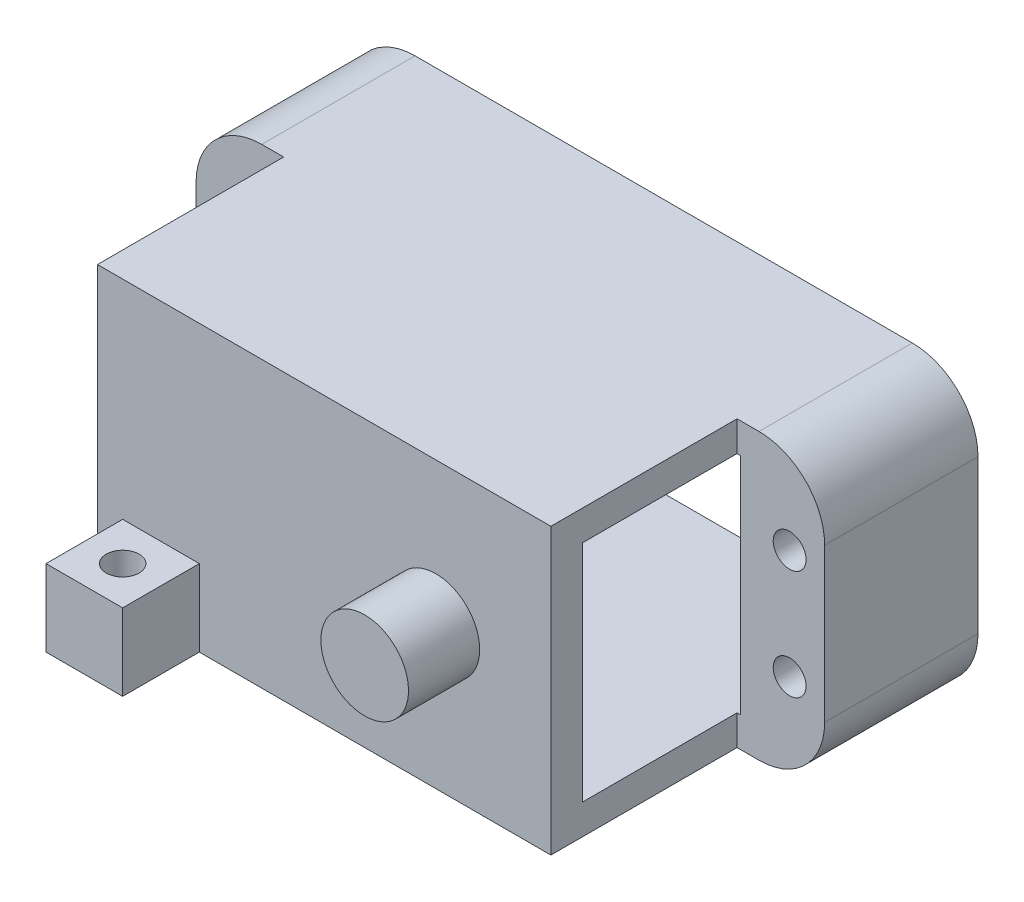
ISO-10303-21;
HEADER;
FILE_DESCRIPTION(('STEP AP214'),'2;1');
FILE_NAME('part.step','',(''),(''),'','','');
FILE_SCHEMA(('AUTOMOTIVE_DESIGN { 1 0 10303 214 1 1 1 1 }'));
ENDSEC;
DATA;
#1=APPLICATION_CONTEXT('core data for automotive mechanical design processes');
#2=APPLICATION_PROTOCOL_DEFINITION('international standard','automotive_design',2000,#1);
#3=PRODUCT_CONTEXT('',#1,'mechanical');
#4=PRODUCT('Part','Part','',(#3));
#5=PRODUCT_RELATED_PRODUCT_CATEGORY('part','',(#4));
#6=PRODUCT_DEFINITION_FORMATION('','',#4);
#7=PRODUCT_DEFINITION_CONTEXT('part definition',#1,'design');
#8=PRODUCT_DEFINITION('design','',#6,#7);
#9=PRODUCT_DEFINITION_SHAPE('','',#8);
#10=(LENGTH_UNIT() NAMED_UNIT(*) SI_UNIT(.MILLI.,.METRE.));
#11=(NAMED_UNIT(*) PLANE_ANGLE_UNIT() SI_UNIT($,.RADIAN.));
#12=(NAMED_UNIT(*) SI_UNIT($,.STERADIAN.) SOLID_ANGLE_UNIT());
#13=UNCERTAINTY_MEASURE_WITH_UNIT(LENGTH_MEASURE(1.E-05),#10,'distance_accuracy_value','');
#14=(GEOMETRIC_REPRESENTATION_CONTEXT(3) GLOBAL_UNCERTAINTY_ASSIGNED_CONTEXT((#13)) GLOBAL_UNIT_ASSIGNED_CONTEXT((#10,
#11,#12)) REPRESENTATION_CONTEXT('',''));
#15=CARTESIAN_POINT('',(0.,0.,0.));
#16=DIRECTION('',(0.,0.,1.));
#17=DIRECTION('',(1.,0.,0.));
#18=AXIS2_PLACEMENT_3D('',#15,#16,#17);
#19=CARTESIAN_POINT('',(0.,0.,31.));
#20=DIRECTION('',(0.,0.,-1.));
#21=DIRECTION('',(-1.,0.,0.));
#22=AXIS2_PLACEMENT_3D('',#19,#20,#21);
#23=PLANE('',#22);
#24=CARTESIAN_POINT('',(10.2,0.,31.));
#25=DIRECTION('',(0.,0.,-1.));
#26=DIRECTION('',(-1.,0.,0.));
#27=AXIS2_PLACEMENT_3D('',#24,#25,#26);
#28=CIRCLE('',#27,4.);
#29=CARTESIAN_POINT('',(6.2,0.,31.));
#30=VERTEX_POINT('',#29);
#31=EDGE_CURVE('E867',#30,#30,#28,.T.);
#32=ORIENTED_EDGE('',*,*,#31,.T.);
#33=EDGE_LOOP('',(#32));
#34=FACE_BOUND('',#33,.T.);
#35=DIRECTION('',(0.,1.,0.));
#36=VECTOR('',#35,1.);
#37=CARTESIAN_POINT('',(-11.4,-13.,31.));
#38=LINE('',#37,#36);
#39=CARTESIAN_POINT('',(-11.4,-13.,31.));
#40=VERTEX_POINT('',#39);
#41=CARTESIAN_POINT('',(-11.4,-6.,31.));
#42=VERTEX_POINT('',#41);
#43=EDGE_CURVE('E239',#40,#42,#38,.T.);
#44=ORIENTED_EDGE('',*,*,#43,.F.);
#45=DIRECTION('',(1.,0.,0.));
#46=VECTOR('',#45,1.);
#47=CARTESIAN_POINT('',(20.7,-13.,31.));
#48=LINE('',#47,#46);
#49=CARTESIAN_POINT('',(20.7,-13.,31.));
#50=VERTEX_POINT('',#49);
#51=EDGE_CURVE('E353',#40,#50,#48,.T.);
#52=ORIENTED_EDGE('',*,*,#51,.T.);
#53=DIRECTION('',(0.,1.,0.));
#54=VECTOR('',#53,1.);
#55=CARTESIAN_POINT('',(20.7,13.,31.));
#56=LINE('',#55,#54);
#57=CARTESIAN_POINT('',(20.7,13.,31.));
#58=VERTEX_POINT('',#57);
#59=EDGE_CURVE('E356',#50,#58,#56,.T.);
#60=ORIENTED_EDGE('',*,*,#59,.T.);
#61=DIRECTION('',(-1.,0.,0.));
#62=VECTOR('',#61,1.);
#63=CARTESIAN_POINT('',(-20.7,13.,31.));
#64=LINE('',#63,#62);
#65=CARTESIAN_POINT('',(-20.7,13.,31.));
#66=VERTEX_POINT('',#65);
#67=EDGE_CURVE('E347',#58,#66,#64,.T.);
#68=ORIENTED_EDGE('',*,*,#67,.T.);
#69=DIRECTION('',(0.,-1.,0.));
#70=VECTOR('',#69,1.);
#71=CARTESIAN_POINT('',(-20.7,-13.,31.));
#72=LINE('',#71,#70);
#73=CARTESIAN_POINT('',(-20.7,-13.,31.));
#74=VERTEX_POINT('',#73);
#75=EDGE_CURVE('E350',#66,#74,#72,.T.);
#76=ORIENTED_EDGE('',*,*,#75,.T.);
#77=CARTESIAN_POINT('',(-18.4,-13.,31.));
#78=VERTEX_POINT('',#77);
#79=EDGE_CURVE('E354',#74,#78,#48,.T.);
#80=ORIENTED_EDGE('',*,*,#79,.T.);
#81=DIRECTION('',(0.,-1.,0.));
#82=VECTOR('',#81,1.);
#83=CARTESIAN_POINT('',(-18.4,-5.99999999999999,31.));
#84=LINE('',#83,#82);
#85=CARTESIAN_POINT('',(-18.4,-5.99999999999999,31.));
#86=VERTEX_POINT('',#85);
#87=EDGE_CURVE('E859',#86,#78,#84,.T.);
#88=ORIENTED_EDGE('',*,*,#87,.F.);
#89=DIRECTION('',(-1.,0.,0.));
#90=VECTOR('',#89,1.);
#91=CARTESIAN_POINT('',(-11.4,-6.,31.));
#92=LINE('',#91,#90);
#93=EDGE_CURVE('E242',#42,#86,#92,.T.);
#94=ORIENTED_EDGE('',*,*,#93,.F.);
#95=EDGE_LOOP('',(#44,#52,#60,#68,#76,#80,#88,#94));
#96=FACE_BOUND('',#95,.T.);
#97=ADVANCED_FACE('F33',(#34,#96),#23,.F.);
#98=CARTESIAN_POINT('',(0.,0.,14.));
#99=DIRECTION('',(0.,0.,-1.));
#100=DIRECTION('',(-1.,0.,0.));
#101=AXIS2_PLACEMENT_3D('',#98,#99,#100);
#102=PLANE('',#101);
#103=CARTESIAN_POINT('',(25.5,-5.,14.));
#104=DIRECTION('',(0.,0.,-1.));
#105=DIRECTION('',(-1.,0.,0.));
#106=AXIS2_PLACEMENT_3D('',#103,#104,#105);
#107=CIRCLE('',#106,1.49999999999999);
#108=CARTESIAN_POINT('',(24.,-5.,14.));
#109=VERTEX_POINT('',#108);
#110=EDGE_CURVE('E887',#109,#109,#107,.T.);
#111=ORIENTED_EDGE('',*,*,#110,.T.);
#112=EDGE_LOOP('',(#111));
#113=FACE_BOUND('',#112,.T.);
#114=CARTESIAN_POINT('',(25.5,5.,14.));
#115=DIRECTION('',(0.,0.,-1.));
#116=DIRECTION('',(-1.,0.,0.));
#117=AXIS2_PLACEMENT_3D('',#114,#115,#116);
#118=CIRCLE('',#117,1.49999999999999);
#119=CARTESIAN_POINT('',(24.,5.,14.));
#120=VERTEX_POINT('',#119);
#121=EDGE_CURVE('E881',#120,#120,#118,.T.);
#122=ORIENTED_EDGE('',*,*,#121,.T.);
#123=EDGE_LOOP('',(#122));
#124=FACE_BOUND('',#123,.T.);
#125=DIRECTION('',(0.,-1.,0.));
#126=VECTOR('',#125,1.);
#127=CARTESIAN_POINT('',(28.7,-13.,14.));
#128=LINE('',#127,#126);
#129=CARTESIAN_POINT('',(28.7,6.99999999999999,14.));
#130=VERTEX_POINT('',#129);
#131=CARTESIAN_POINT('',(28.7,-7.,14.));
#132=VERTEX_POINT('',#131);
#133=EDGE_CURVE('E282',#130,#132,#128,.T.);
#134=ORIENTED_EDGE('',*,*,#133,.F.);
#135=CARTESIAN_POINT('',(22.7,7.,14.));
#136=DIRECTION('',(0.,0.,-1.));
#137=DIRECTION('',(-1.,0.,0.));
#138=AXIS2_PLACEMENT_3D('',#135,#136,#137);
#139=CIRCLE('',#138,6.);
#140=CARTESIAN_POINT('',(22.7,13.,14.));
#141=VERTEX_POINT('',#140);
#142=EDGE_CURVE('E410',#130,#141,#139,.F.);
#143=ORIENTED_EDGE('',*,*,#142,.T.);
#144=DIRECTION('',(1.,0.,0.));
#145=VECTOR('',#144,1.);
#146=CARTESIAN_POINT('',(-28.7,13.,14.));
#147=LINE('',#146,#145);
#148=CARTESIAN_POINT('',(20.7,13.,14.));
#149=VERTEX_POINT('',#148);
#150=EDGE_CURVE('E380',#149,#141,#147,.T.);
#151=ORIENTED_EDGE('',*,*,#150,.F.);
#152=DIRECTION('',(0.,1.,0.));
#153=VECTOR('',#152,1.);
#154=CARTESIAN_POINT('',(20.7,13.,14.));
#155=LINE('',#154,#153);
#156=CARTESIAN_POINT('',(20.7,10.25,14.));
#157=VERTEX_POINT('',#156);
#158=EDGE_CURVE('E362',#157,#149,#155,.T.);
#159=ORIENTED_EDGE('',*,*,#158,.F.);
#160=DIRECTION('',(1.,0.,0.));
#161=VECTOR('',#160,1.);
#162=CARTESIAN_POINT('',(20.7,10.25,14.));
#163=LINE('',#162,#161);
#164=CARTESIAN_POINT('',(21.,10.25,14.));
#165=VERTEX_POINT('',#164);
#166=EDGE_CURVE('E316',#157,#165,#163,.T.);
#167=ORIENTED_EDGE('',*,*,#166,.T.);
#168=DIRECTION('',(0.,-1.,0.));
#169=VECTOR('',#168,1.);
#170=CARTESIAN_POINT('',(21.,-13.,14.));
#171=LINE('',#170,#169);
#172=CARTESIAN_POINT('',(21.,-10.25,14.));
#173=VERTEX_POINT('',#172);
#174=EDGE_CURVE('E283',#165,#173,#171,.T.);
#175=ORIENTED_EDGE('',*,*,#174,.T.);
#176=DIRECTION('',(1.,0.,0.));
#177=VECTOR('',#176,1.);
#178=CARTESIAN_POINT('',(20.7,-10.25,14.));
#179=LINE('',#178,#177);
#180=CARTESIAN_POINT('',(20.7,-10.25,14.));
#181=VERTEX_POINT('',#180);
#182=EDGE_CURVE('E293',#181,#173,#179,.T.);
#183=ORIENTED_EDGE('',*,*,#182,.F.);
#184=CARTESIAN_POINT('',(20.7,-13.,14.));
#185=VERTEX_POINT('',#184);
#186=EDGE_CURVE('E351',#185,#181,#155,.T.);
#187=ORIENTED_EDGE('',*,*,#186,.F.);
#188=DIRECTION('',(-1.,0.,0.));
#189=VECTOR('',#188,1.);
#190=CARTESIAN_POINT('',(21.,-13.,14.));
#191=LINE('',#190,#189);
#192=CARTESIAN_POINT('',(22.7,-13.,14.));
#193=VERTEX_POINT('',#192);
#194=EDGE_CURVE('E381',#193,#185,#191,.T.);
#195=ORIENTED_EDGE('',*,*,#194,.F.);
#196=CARTESIAN_POINT('',(22.7,-7.,14.));
#197=DIRECTION('',(0.,0.,-1.));
#198=DIRECTION('',(-1.,0.,0.));
#199=AXIS2_PLACEMENT_3D('',#196,#197,#198);
#200=CIRCLE('',#199,6.);
#201=EDGE_CURVE('E408',#193,#132,#200,.F.);
#202=ORIENTED_EDGE('',*,*,#201,.T.);
#203=EDGE_LOOP('',(#134,#143,#151,#159,#167,#175,#183,#187,#195,#202));
#204=FACE_BOUND('',#203,.T.);
#205=ADVANCED_FACE('F500',(#113,#124,#204),#102,.F.);
#206=CARTESIAN_POINT('',(-25.5,-5.,14.));
#207=DIRECTION('',(0.,0.,-1.));
#208=DIRECTION('',(-1.,0.,0.));
#209=AXIS2_PLACEMENT_3D('',#206,#207,#208);
#210=CIRCLE('',#209,1.49999999999999);
#211=CARTESIAN_POINT('',(-27.,-5.,14.));
#212=VERTEX_POINT('',#211);
#213=EDGE_CURVE('E875',#212,#212,#210,.T.);
#214=ORIENTED_EDGE('',*,*,#213,.T.);
#215=EDGE_LOOP('',(#214));
#216=FACE_BOUND('',#215,.T.);
#217=CARTESIAN_POINT('',(-25.5,5.,14.));
#218=DIRECTION('',(0.,0.,-1.));
#219=DIRECTION('',(-1.,0.,0.));
#220=AXIS2_PLACEMENT_3D('',#217,#218,#219);
#221=CIRCLE('',#220,1.49999999999999);
#222=CARTESIAN_POINT('',(-27.,5.,14.));
#223=VERTEX_POINT('',#222);
#224=EDGE_CURVE('E869',#223,#223,#221,.T.);
#225=ORIENTED_EDGE('',*,*,#224,.T.);
#226=EDGE_LOOP('',(#225));
#227=FACE_BOUND('',#226,.T.);
#228=CARTESIAN_POINT('',(-22.7,13.,14.));
#229=VERTEX_POINT('',#228);
#230=CARTESIAN_POINT('',(-20.7,13.,14.));
#231=VERTEX_POINT('',#230);
#232=EDGE_CURVE('E377',#229,#231,#147,.T.);
#233=ORIENTED_EDGE('',*,*,#232,.F.);
#234=CARTESIAN_POINT('',(-22.7,7.,14.));
#235=DIRECTION('',(0.,0.,-1.));
#236=DIRECTION('',(-1.,0.,0.));
#237=AXIS2_PLACEMENT_3D('',#234,#235,#236);
#238=CIRCLE('',#237,6.);
#239=CARTESIAN_POINT('',(-28.7,6.99999999999999,14.));
#240=VERTEX_POINT('',#239);
#241=EDGE_CURVE('E11',#229,#240,#238,.F.);
#242=ORIENTED_EDGE('',*,*,#241,.T.);
#243=DIRECTION('',(0.,1.,0.));
#244=VECTOR('',#243,1.);
#245=CARTESIAN_POINT('',(-28.7,-13.,14.));
#246=LINE('',#245,#244);
#247=CARTESIAN_POINT('',(-28.7,-7.,14.));
#248=VERTEX_POINT('',#247);
#249=EDGE_CURVE('E383',#248,#240,#246,.T.);
#250=ORIENTED_EDGE('',*,*,#249,.F.);
#251=CARTESIAN_POINT('',(-22.7,-7.,14.));
#252=DIRECTION('',(0.,0.,-1.));
#253=DIRECTION('',(-1.,0.,0.));
#254=AXIS2_PLACEMENT_3D('',#251,#252,#253);
#255=CIRCLE('',#254,6.);
#256=CARTESIAN_POINT('',(-22.7,-13.,14.));
#257=VERTEX_POINT('',#256);
#258=EDGE_CURVE('E41',#248,#257,#255,.F.);
#259=ORIENTED_EDGE('',*,*,#258,.T.);
#260=CARTESIAN_POINT('',(-20.7,-13.,14.));
#261=VERTEX_POINT('',#260);
#262=EDGE_CURVE('E379',#261,#257,#191,.T.);
#263=ORIENTED_EDGE('',*,*,#262,.F.);
#264=DIRECTION('',(0.,-1.,0.));
#265=VECTOR('',#264,1.);
#266=CARTESIAN_POINT('',(-20.7,-13.,14.));
#267=LINE('',#266,#265);
#268=CARTESIAN_POINT('',(-20.7,-10.25,14.));
#269=VERTEX_POINT('',#268);
#270=EDGE_CURVE('E339',#269,#261,#267,.T.);
#271=ORIENTED_EDGE('',*,*,#270,.F.);
#272=DIRECTION('',(1.,0.,0.));
#273=VECTOR('',#272,1.);
#274=CARTESIAN_POINT('',(-21.,-10.25,14.));
#275=LINE('',#274,#273);
#276=CARTESIAN_POINT('',(-21.,-10.25,14.));
#277=VERTEX_POINT('',#276);
#278=EDGE_CURVE('E306',#277,#269,#275,.T.);
#279=ORIENTED_EDGE('',*,*,#278,.F.);
#280=DIRECTION('',(0.,1.,0.));
#281=VECTOR('',#280,1.);
#282=CARTESIAN_POINT('',(-21.,-10.25,14.));
#283=LINE('',#282,#281);
#284=CARTESIAN_POINT('',(-21.,10.25,14.));
#285=VERTEX_POINT('',#284);
#286=EDGE_CURVE('E343',#277,#285,#283,.T.);
#287=ORIENTED_EDGE('',*,*,#286,.T.);
#288=DIRECTION('',(1.,0.,0.));
#289=VECTOR('',#288,1.);
#290=CARTESIAN_POINT('',(-21.,10.25,14.));
#291=LINE('',#290,#289);
#292=CARTESIAN_POINT('',(-20.7,10.25,14.));
#293=VERTEX_POINT('',#292);
#294=EDGE_CURVE('E328',#285,#293,#291,.T.);
#295=ORIENTED_EDGE('',*,*,#294,.T.);
#296=EDGE_CURVE('E359',#231,#293,#267,.T.);
#297=ORIENTED_EDGE('',*,*,#296,.F.);
#298=EDGE_LOOP('',(#233,#242,#250,#259,#263,#271,#279,#287,#295,#297));
#299=FACE_BOUND('',#298,.T.);
#300=ADVANCED_FACE('F435',(#216,#227,#299),#102,.F.);
#301=CARTESIAN_POINT('',(-28.7,13.,14.));
#302=DIRECTION('',(0.,1.,0.));
#303=DIRECTION('',(0.,0.,1.));
#304=AXIS2_PLACEMENT_3D('',#301,#302,#303);
#305=PLANE('',#304);
#306=ORIENTED_EDGE('',*,*,#150,.T.);
#307=DIRECTION('',(0.,0.,1.));
#308=VECTOR('',#307,1.);
#309=CARTESIAN_POINT('',(22.7,13.,0.));
#310=LINE('',#309,#308);
#311=CARTESIAN_POINT('',(22.7,13.,0.));
#312=VERTEX_POINT('',#311);
#313=EDGE_CURVE('E414',#141,#312,#310,.F.);
#314=ORIENTED_EDGE('',*,*,#313,.T.);
#315=DIRECTION('',(1.,0.,0.));
#316=VECTOR('',#315,1.);
#317=CARTESIAN_POINT('',(-28.7,13.,0.));
#318=LINE('',#317,#316);
#319=CARTESIAN_POINT('',(-22.7,13.,0.));
#320=VERTEX_POINT('',#319);
#321=EDGE_CURVE('E376',#320,#312,#318,.T.);
#322=ORIENTED_EDGE('',*,*,#321,.F.);
#323=DIRECTION('',(0.,0.,-1.));
#324=VECTOR('',#323,1.);
#325=CARTESIAN_POINT('',(-22.7,13.,14.));
#326=LINE('',#325,#324);
#327=EDGE_CURVE('E412',#320,#229,#326,.F.);
#328=ORIENTED_EDGE('',*,*,#327,.T.);
#329=ORIENTED_EDGE('',*,*,#232,.T.);
#330=DIRECTION('',(0.,0.,-1.));
#331=VECTOR('',#330,1.);
#332=CARTESIAN_POINT('',(-20.7,13.,31.));
#333=LINE('',#332,#331);
#334=EDGE_CURVE('E373',#66,#231,#333,.T.);
#335=ORIENTED_EDGE('',*,*,#334,.F.);
#336=ORIENTED_EDGE('',*,*,#67,.F.);
#337=DIRECTION('',(0.,0.,-1.));
#338=VECTOR('',#337,1.);
#339=CARTESIAN_POINT('',(20.7,13.,31.));
#340=LINE('',#339,#338);
#341=EDGE_CURVE('E358',#58,#149,#340,.T.);
#342=ORIENTED_EDGE('',*,*,#341,.T.);
#343=EDGE_LOOP('',(#306,#314,#322,#328,#329,#335,#336,#342));
#344=FACE_BOUND('',#343,.T.);
#345=ADVANCED_FACE('F457',(#344),#305,.T.);
#346=CARTESIAN_POINT('',(-28.7,-13.,14.));
#347=DIRECTION('',(-1.,0.,0.));
#348=DIRECTION('',(0.,0.,1.));
#349=AXIS2_PLACEMENT_3D('',#346,#347,#348);
#350=PLANE('',#349);
#351=ORIENTED_EDGE('',*,*,#249,.T.);
#352=DIRECTION('',(0.,0.,-1.));
#353=VECTOR('',#352,1.);
#354=CARTESIAN_POINT('',(-28.7,7.,14.));
#355=LINE('',#354,#353);
#356=CARTESIAN_POINT('',(-28.7,6.99999999999999,0.));
#357=VERTEX_POINT('',#356);
#358=EDGE_CURVE('E430',#240,#357,#355,.T.);
#359=ORIENTED_EDGE('',*,*,#358,.T.);
#360=DIRECTION('',(0.,1.,0.));
#361=VECTOR('',#360,1.);
#362=CARTESIAN_POINT('',(-28.7,-13.,0.));
#363=LINE('',#362,#361);
#364=CARTESIAN_POINT('',(-28.7,-7.,0.));
#365=VERTEX_POINT('',#364);
#366=EDGE_CURVE('E391',#365,#357,#363,.T.);
#367=ORIENTED_EDGE('',*,*,#366,.F.);
#368=DIRECTION('',(0.,0.,-1.));
#369=VECTOR('',#368,1.);
#370=CARTESIAN_POINT('',(-28.7,-7.,14.));
#371=LINE('',#370,#369);
#372=EDGE_CURVE('E53',#365,#248,#371,.F.);
#373=ORIENTED_EDGE('',*,*,#372,.T.);
#374=EDGE_LOOP('',(#351,#359,#367,#373));
#375=FACE_BOUND('',#374,.T.);
#376=ADVANCED_FACE('F448',(#375),#350,.T.);
#377=CARTESIAN_POINT('',(21.,-13.,14.));
#378=DIRECTION('',(0.,-1.,0.));
#379=DIRECTION('',(0.,0.,-1.));
#380=AXIS2_PLACEMENT_3D('',#377,#378,#379);
#381=PLANE('',#380);
#382=CARTESIAN_POINT('',(-14.9,-13.,34.5));
#383=DIRECTION('',(0.,-1.,0.));
#384=DIRECTION('',(0.,0.,-1.));
#385=AXIS2_PLACEMENT_3D('',#382,#383,#384);
#386=CIRCLE('',#385,1.49999999999999);
#387=CARTESIAN_POINT('',(-14.9,-13.,33.));
#388=VERTEX_POINT('',#387);
#389=EDGE_CURVE('E402',#388,#388,#386,.T.);
#390=ORIENTED_EDGE('',*,*,#389,.F.);
#391=EDGE_LOOP('',(#390));
#392=FACE_BOUND('',#391,.T.);
#393=DIRECTION('',(-1.,0.,0.));
#394=VECTOR('',#393,1.);
#395=CARTESIAN_POINT('',(21.,-13.,0.));
#396=LINE('',#395,#394);
#397=CARTESIAN_POINT('',(22.7,-13.,0.));
#398=VERTEX_POINT('',#397);
#399=CARTESIAN_POINT('',(-2.4,-13.,0.));
#400=VERTEX_POINT('',#399);
#401=EDGE_CURVE('E389',#398,#400,#396,.T.);
#402=ORIENTED_EDGE('',*,*,#401,.F.);
#403=DIRECTION('',(0.,0.,-1.));
#404=VECTOR('',#403,1.);
#405=CARTESIAN_POINT('',(22.7,-13.,14.));
#406=LINE('',#405,#404);
#407=EDGE_CURVE('E427',#398,#193,#406,.F.);
#408=ORIENTED_EDGE('',*,*,#407,.T.);
#409=ORIENTED_EDGE('',*,*,#194,.T.);
#410=DIRECTION('',(0.,0.,-1.));
#411=VECTOR('',#410,1.);
#412=CARTESIAN_POINT('',(20.7,-13.,31.));
#413=LINE('',#412,#411);
#414=EDGE_CURVE('E367',#50,#185,#413,.T.);
#415=ORIENTED_EDGE('',*,*,#414,.F.);
#416=ORIENTED_EDGE('',*,*,#51,.F.);
#417=DIRECTION('',(0.,0.,-1.));
#418=VECTOR('',#417,1.);
#419=CARTESIAN_POINT('',(-11.4,-13.,38.));
#420=LINE('',#419,#418);
#421=CARTESIAN_POINT('',(-11.4,-13.,38.));
#422=VERTEX_POINT('',#421);
#423=EDGE_CURVE('E248',#422,#40,#420,.T.);
#424=ORIENTED_EDGE('',*,*,#423,.F.);
#425=DIRECTION('',(1.,0.,0.));
#426=VECTOR('',#425,1.);
#427=CARTESIAN_POINT('',(-18.4,-13.,38.));
#428=LINE('',#427,#426);
#429=CARTESIAN_POINT('',(-18.4,-13.,38.));
#430=VERTEX_POINT('',#429);
#431=EDGE_CURVE('E229',#430,#422,#428,.T.);
#432=ORIENTED_EDGE('',*,*,#431,.F.);
#433=DIRECTION('',(0.,0.,-1.));
#434=VECTOR('',#433,1.);
#435=CARTESIAN_POINT('',(-18.4,-13.,38.));
#436=LINE('',#435,#434);
#437=EDGE_CURVE('E226',#430,#78,#436,.T.);
#438=ORIENTED_EDGE('',*,*,#437,.T.);
#439=ORIENTED_EDGE('',*,*,#79,.F.);
#440=DIRECTION('',(0.,0.,-1.));
#441=VECTOR('',#440,1.);
#442=CARTESIAN_POINT('',(-20.7,-13.,31.));
#443=LINE('',#442,#441);
#444=EDGE_CURVE('E370',#74,#261,#443,.T.);
#445=ORIENTED_EDGE('',*,*,#444,.T.);
#446=ORIENTED_EDGE('',*,*,#262,.T.);
#447=DIRECTION('',(0.,0.,-1.));
#448=VECTOR('',#447,1.);
#449=CARTESIAN_POINT('',(-22.7,-13.,14.));
#450=LINE('',#449,#448);
#451=CARTESIAN_POINT('',(-22.7,-13.,0.));
#452=VERTEX_POINT('',#451);
#453=EDGE_CURVE('E424',#257,#452,#450,.T.);
#454=ORIENTED_EDGE('',*,*,#453,.T.);
#455=CARTESIAN_POINT('',(-10.4,-13.,0.));
#456=VERTEX_POINT('',#455);
#457=EDGE_CURVE('E388',#456,#452,#396,.T.);
#458=ORIENTED_EDGE('',*,*,#457,.F.);
#459=DIRECTION('',(0.,0.,-1.));
#460=VECTOR('',#459,1.);
#461=CARTESIAN_POINT('',(-10.4,-13.,14.));
#462=LINE('',#461,#460);
#463=CARTESIAN_POINT('',(-10.4,-13.,5.));
#464=VERTEX_POINT('',#463);
#465=EDGE_CURVE('E246',#464,#456,#462,.T.);
#466=ORIENTED_EDGE('',*,*,#465,.F.);
#467=DIRECTION('',(-1.,0.,0.));
#468=VECTOR('',#467,1.);
#469=CARTESIAN_POINT('',(21.,-13.,5.));
#470=LINE('',#469,#468);
#471=CARTESIAN_POINT('',(-2.4,-13.,5.));
#472=VERTEX_POINT('',#471);
#473=EDGE_CURVE('E243',#472,#464,#470,.T.);
#474=ORIENTED_EDGE('',*,*,#473,.F.);
#475=DIRECTION('',(0.,0.,1.));
#476=VECTOR('',#475,1.);
#477=CARTESIAN_POINT('',(-2.4,-13.,14.));
#478=LINE('',#477,#476);
#479=EDGE_CURVE('E256',#400,#472,#478,.T.);
#480=ORIENTED_EDGE('',*,*,#479,.F.);
#481=EDGE_LOOP('',(#402,#408,#409,#415,#416,#424,#432,#438,#439,#445,#446,#454,#458,#466,#474,#480));
#482=FACE_BOUND('',#481,.T.);
#483=ADVANCED_FACE('F441',(#392,#482),#381,.T.);
#484=CARTESIAN_POINT('',(0.,0.,0.));
#485=DIRECTION('',(0.,0.,-1.));
#486=DIRECTION('',(-1.,0.,0.));
#487=AXIS2_PLACEMENT_3D('',#484,#485,#486);
#488=PLANE('',#487);
#489=CARTESIAN_POINT('',(25.5,-5.,0.));
#490=DIRECTION('',(0.,0.,-1.));
#491=DIRECTION('',(-1.,0.,0.));
#492=AXIS2_PLACEMENT_3D('',#489,#490,#491);
#493=CIRCLE('',#492,1.49999999999999);
#494=CARTESIAN_POINT('',(24.,-5.,0.));
#495=VERTEX_POINT('',#494);
#496=EDGE_CURVE('E397',#495,#495,#493,.T.);
#497=ORIENTED_EDGE('',*,*,#496,.F.);
#498=EDGE_LOOP('',(#497));
#499=FACE_BOUND('',#498,.T.);
#500=CARTESIAN_POINT('',(25.5,5.,0.));
#501=DIRECTION('',(0.,0.,-1.));
#502=DIRECTION('',(-1.,0.,0.));
#503=AXIS2_PLACEMENT_3D('',#500,#501,#502);
#504=CIRCLE('',#503,1.49999999999999);
#505=CARTESIAN_POINT('',(24.,5.,0.));
#506=VERTEX_POINT('',#505);
#507=EDGE_CURVE('E884',#506,#506,#504,.T.);
#508=ORIENTED_EDGE('',*,*,#507,.F.);
#509=EDGE_LOOP('',(#508));
#510=FACE_BOUND('',#509,.T.);
#511=CARTESIAN_POINT('',(-25.5,-5.,0.));
#512=DIRECTION('',(0.,0.,-1.));
#513=DIRECTION('',(-1.,0.,0.));
#514=AXIS2_PLACEMENT_3D('',#511,#512,#513);
#515=CIRCLE('',#514,1.49999999999999);
#516=CARTESIAN_POINT('',(-27.,-5.,0.));
#517=VERTEX_POINT('',#516);
#518=EDGE_CURVE('E878',#517,#517,#515,.T.);
#519=ORIENTED_EDGE('',*,*,#518,.F.);
#520=EDGE_LOOP('',(#519));
#521=FACE_BOUND('',#520,.T.);
#522=CARTESIAN_POINT('',(-25.5,5.,0.));
#523=DIRECTION('',(0.,0.,-1.));
#524=DIRECTION('',(-1.,0.,0.));
#525=AXIS2_PLACEMENT_3D('',#522,#523,#524);
#526=CIRCLE('',#525,1.49999999999999);
#527=CARTESIAN_POINT('',(-27.,5.,0.));
#528=VERTEX_POINT('',#527);
#529=EDGE_CURVE('E872',#528,#528,#526,.T.);
#530=ORIENTED_EDGE('',*,*,#529,.F.);
#531=EDGE_LOOP('',(#530));
#532=FACE_BOUND('',#531,.T.);
#533=ORIENTED_EDGE('',*,*,#321,.T.);
#534=CARTESIAN_POINT('',(22.7,7.,0.));
#535=DIRECTION('',(0.,0.,-1.));
#536=DIRECTION('',(-1.,0.,0.));
#537=AXIS2_PLACEMENT_3D('',#534,#535,#536);
#538=CIRCLE('',#537,6.);
#539=CARTESIAN_POINT('',(28.7,7.,0.));
#540=VERTEX_POINT('',#539);
#541=EDGE_CURVE('E422',#312,#540,#538,.T.);
#542=ORIENTED_EDGE('',*,*,#541,.T.);
#543=DIRECTION('',(0.,1.,0.));
#544=VECTOR('',#543,1.);
#545=CARTESIAN_POINT('',(28.7,13.,0.));
#546=LINE('',#545,#544);
#547=CARTESIAN_POINT('',(28.7,-6.99999999999999,0.));
#548=VERTEX_POINT('',#547);
#549=EDGE_CURVE('E279',#548,#540,#546,.T.);
#550=ORIENTED_EDGE('',*,*,#549,.F.);
#551=CARTESIAN_POINT('',(22.7,-7.,0.));
#552=DIRECTION('',(0.,0.,-1.));
#553=DIRECTION('',(-1.,0.,0.));
#554=AXIS2_PLACEMENT_3D('',#551,#552,#553);
#555=CIRCLE('',#554,6.);
#556=EDGE_CURVE('E420',#548,#398,#555,.T.);
#557=ORIENTED_EDGE('',*,*,#556,.T.);
#558=ORIENTED_EDGE('',*,*,#401,.T.);
#559=DIRECTION('',(0.,1.,0.));
#560=VECTOR('',#559,1.);
#561=CARTESIAN_POINT('',(-2.4,-20.,0.));
#562=LINE('',#561,#560);
#563=CARTESIAN_POINT('',(-2.4,-20.,0.));
#564=VERTEX_POINT('',#563);
#565=EDGE_CURVE('E269',#564,#400,#562,.T.);
#566=ORIENTED_EDGE('',*,*,#565,.F.);
#567=DIRECTION('',(1.,0.,0.));
#568=VECTOR('',#567,1.);
#569=CARTESIAN_POINT('',(21.,-20.,0.));
#570=LINE('',#569,#568);
#571=CARTESIAN_POINT('',(-10.4,-20.,0.));
#572=VERTEX_POINT('',#571);
#573=EDGE_CURVE('E258',#572,#564,#570,.T.);
#574=ORIENTED_EDGE('',*,*,#573,.F.);
#575=DIRECTION('',(0.,1.,0.));
#576=VECTOR('',#575,1.);
#577=CARTESIAN_POINT('',(-10.4,-20.,0.));
#578=LINE('',#577,#576);
#579=EDGE_CURVE('E272',#572,#456,#578,.T.);
#580=ORIENTED_EDGE('',*,*,#579,.T.);
#581=ORIENTED_EDGE('',*,*,#457,.T.);
#582=CARTESIAN_POINT('',(-22.7,-7.,0.));
#583=DIRECTION('',(0.,0.,-1.));
#584=DIRECTION('',(-1.,0.,0.));
#585=AXIS2_PLACEMENT_3D('',#582,#583,#584);
#586=CIRCLE('',#585,6.);
#587=EDGE_CURVE('E416',#452,#365,#586,.T.);
#588=ORIENTED_EDGE('',*,*,#587,.T.);
#589=ORIENTED_EDGE('',*,*,#366,.T.);
#590=CARTESIAN_POINT('',(-22.7,7.,0.));
#591=DIRECTION('',(0.,0.,-1.));
#592=DIRECTION('',(-1.,0.,0.));
#593=AXIS2_PLACEMENT_3D('',#590,#591,#592);
#594=CIRCLE('',#593,6.);
#595=EDGE_CURVE('E418',#357,#320,#594,.T.);
#596=ORIENTED_EDGE('',*,*,#595,.T.);
#597=EDGE_LOOP('',(#533,#542,#550,#557,#558,#566,#574,#580,#581,#588,#589,#596));
#598=FACE_BOUND('',#597,.T.);
#599=DIRECTION('',(-1.,0.,0.));
#600=VECTOR('',#599,1.);
#601=CARTESIAN_POINT('',(21.,-10.25,0.));
#602=LINE('',#601,#600);
#603=CARTESIAN_POINT('',(21.,-10.25,0.));
#604=VERTEX_POINT('',#603);
#605=CARTESIAN_POINT('',(-21.,-10.25,0.));
#606=VERTEX_POINT('',#605);
#607=EDGE_CURVE('E300',#604,#606,#602,.T.);
#608=ORIENTED_EDGE('',*,*,#607,.F.);
#609=DIRECTION('',(0.,1.,0.));
#610=VECTOR('',#609,1.);
#611=CARTESIAN_POINT('',(21.,13.,0.));
#612=LINE('',#611,#610);
#613=CARTESIAN_POINT('',(21.,10.25,0.));
#614=VERTEX_POINT('',#613);
#615=EDGE_CURVE('E278',#604,#614,#612,.T.);
#616=ORIENTED_EDGE('',*,*,#615,.T.);
#617=DIRECTION('',(-1.,0.,0.));
#618=VECTOR('',#617,1.);
#619=CARTESIAN_POINT('',(21.,10.25,0.));
#620=LINE('',#619,#618);
#621=CARTESIAN_POINT('',(-21.,10.25,0.));
#622=VERTEX_POINT('',#621);
#623=EDGE_CURVE('E322',#614,#622,#620,.T.);
#624=ORIENTED_EDGE('',*,*,#623,.T.);
#625=DIRECTION('',(0.,1.,0.));
#626=VECTOR('',#625,1.);
#627=CARTESIAN_POINT('',(-21.,-10.25,0.));
#628=LINE('',#627,#626);
#629=EDGE_CURVE('E313',#606,#622,#628,.T.);
#630=ORIENTED_EDGE('',*,*,#629,.F.);
#631=EDGE_LOOP('',(#608,#616,#624,#630));
#632=FACE_BOUND('',#631,.T.);
#633=ADVANCED_FACE('F446',(#499,#510,#521,#532,#598,#632),#488,.T.);
#634=CARTESIAN_POINT('',(-20.7,-13.,31.));
#635=DIRECTION('',(1.,0.,0.));
#636=DIRECTION('',(0.,0.,-1.));
#637=AXIS2_PLACEMENT_3D('',#634,#635,#636);
#638=PLANE('',#637);
#639=DIRECTION('',(0.,1.,0.));
#640=VECTOR('',#639,1.);
#641=CARTESIAN_POINT('',(-20.7,-10.25,28.1));
#642=LINE('',#641,#640);
#643=CARTESIAN_POINT('',(-20.7,-10.25,28.1));
#644=VERTEX_POINT('',#643);
#645=CARTESIAN_POINT('',(-20.7,10.25,28.1));
#646=VERTEX_POINT('',#645);
#647=EDGE_CURVE('E340',#644,#646,#642,.T.);
#648=ORIENTED_EDGE('',*,*,#647,.F.);
#649=DIRECTION('',(0.,0.,1.));
#650=VECTOR('',#649,1.);
#651=CARTESIAN_POINT('',(-20.7,-10.25,14.));
#652=LINE('',#651,#650);
#653=EDGE_CURVE('E308',#269,#644,#652,.T.);
#654=ORIENTED_EDGE('',*,*,#653,.F.);
#655=ORIENTED_EDGE('',*,*,#270,.T.);
#656=ORIENTED_EDGE('',*,*,#444,.F.);
#657=ORIENTED_EDGE('',*,*,#75,.F.);
#658=ORIENTED_EDGE('',*,*,#334,.T.);
#659=ORIENTED_EDGE('',*,*,#296,.T.);
#660=DIRECTION('',(0.,0.,1.));
#661=VECTOR('',#660,1.);
#662=CARTESIAN_POINT('',(-20.7,10.25,14.));
#663=LINE('',#662,#661);
#664=EDGE_CURVE('E331',#293,#646,#663,.T.);
#665=ORIENTED_EDGE('',*,*,#664,.T.);
#666=EDGE_LOOP('',(#648,#654,#655,#656,#657,#658,#659,#665));
#667=FACE_BOUND('',#666,.T.);
#668=ADVANCED_FACE('F518',(#667),#638,.F.);
#669=CARTESIAN_POINT('',(20.7,13.,31.));
#670=DIRECTION('',(-1.,0.,0.));
#671=DIRECTION('',(0.,0.,1.));
#672=AXIS2_PLACEMENT_3D('',#669,#670,#671);
#673=PLANE('',#672);
#674=ORIENTED_EDGE('',*,*,#186,.T.);
#675=DIRECTION('',(0.,0.,-1.));
#676=VECTOR('',#675,1.);
#677=CARTESIAN_POINT('',(20.7,-10.25,28.1));
#678=LINE('',#677,#676);
#679=CARTESIAN_POINT('',(20.7,-10.25,28.1));
#680=VERTEX_POINT('',#679);
#681=EDGE_CURVE('E291',#680,#181,#678,.T.);
#682=ORIENTED_EDGE('',*,*,#681,.F.);
#683=DIRECTION('',(0.,1.,0.));
#684=VECTOR('',#683,1.);
#685=CARTESIAN_POINT('',(20.7,-10.25,28.1));
#686=LINE('',#685,#684);
#687=CARTESIAN_POINT('',(20.7,10.25,28.1));
#688=VERTEX_POINT('',#687);
#689=EDGE_CURVE('E336',#680,#688,#686,.T.);
#690=ORIENTED_EDGE('',*,*,#689,.T.);
#691=DIRECTION('',(0.,0.,-1.));
#692=VECTOR('',#691,1.);
#693=CARTESIAN_POINT('',(20.7,10.25,28.1));
#694=LINE('',#693,#692);
#695=EDGE_CURVE('E286',#688,#157,#694,.T.);
#696=ORIENTED_EDGE('',*,*,#695,.T.);
#697=ORIENTED_EDGE('',*,*,#158,.T.);
#698=ORIENTED_EDGE('',*,*,#341,.F.);
#699=ORIENTED_EDGE('',*,*,#59,.F.);
#700=ORIENTED_EDGE('',*,*,#414,.T.);
#701=EDGE_LOOP('',(#674,#682,#690,#696,#697,#698,#699,#700));
#702=FACE_BOUND('',#701,.T.);
#703=ADVANCED_FACE('F514',(#702),#673,.F.);
#704=CARTESIAN_POINT('',(-20.7,-10.25,28.1));
#705=DIRECTION('',(0.,0.,1.));
#706=DIRECTION('',(1.,0.,0.));
#707=AXIS2_PLACEMENT_3D('',#704,#705,#706);
#708=PLANE('',#707);
#709=DIRECTION('',(1.,0.,0.));
#710=VECTOR('',#709,1.);
#711=CARTESIAN_POINT('',(-20.7,10.25,28.1));
#712=LINE('',#711,#710);
#713=EDGE_CURVE('E294',#646,#688,#712,.T.);
#714=ORIENTED_EDGE('',*,*,#713,.T.);
#715=ORIENTED_EDGE('',*,*,#689,.F.);
#716=DIRECTION('',(1.,0.,0.));
#717=VECTOR('',#716,1.);
#718=CARTESIAN_POINT('',(-20.7,-10.25,28.1));
#719=LINE('',#718,#717);
#720=EDGE_CURVE('E310',#644,#680,#719,.T.);
#721=ORIENTED_EDGE('',*,*,#720,.F.);
#722=ORIENTED_EDGE('',*,*,#647,.T.);
#723=EDGE_LOOP('',(#714,#715,#721,#722));
#724=FACE_BOUND('',#723,.T.);
#725=ADVANCED_FACE('F517',(#724),#708,.F.);
#726=CARTESIAN_POINT('',(-21.,-10.25,0.));
#727=DIRECTION('',(-1.,0.,0.));
#728=DIRECTION('',(0.,0.,1.));
#729=AXIS2_PLACEMENT_3D('',#726,#727,#728);
#730=PLANE('',#729);
#731=DIRECTION('',(0.,0.,1.));
#732=VECTOR('',#731,1.);
#733=CARTESIAN_POINT('',(-21.,10.25,0.));
#734=LINE('',#733,#732);
#735=EDGE_CURVE('E325',#622,#285,#734,.T.);
#736=ORIENTED_EDGE('',*,*,#735,.T.);
#737=ORIENTED_EDGE('',*,*,#286,.F.);
#738=DIRECTION('',(0.,0.,1.));
#739=VECTOR('',#738,1.);
#740=CARTESIAN_POINT('',(-21.,-10.25,0.));
#741=LINE('',#740,#739);
#742=EDGE_CURVE('E303',#606,#277,#741,.T.);
#743=ORIENTED_EDGE('',*,*,#742,.F.);
#744=ORIENTED_EDGE('',*,*,#629,.T.);
#745=EDGE_LOOP('',(#736,#737,#743,#744));
#746=FACE_BOUND('',#745,.T.);
#747=ADVANCED_FACE('F512',(#746),#730,.F.);
#748=CARTESIAN_POINT('',(0.,-10.25,0.));
#749=DIRECTION('',(0.,-1.,0.));
#750=DIRECTION('',(0.,0.,-1.));
#751=AXIS2_PLACEMENT_3D('',#748,#749,#750);
#752=PLANE('',#751);
#753=ORIENTED_EDGE('',*,*,#681,.T.);
#754=ORIENTED_EDGE('',*,*,#182,.T.);
#755=DIRECTION('',(0.,0.,-1.));
#756=VECTOR('',#755,1.);
#757=CARTESIAN_POINT('',(21.,-10.25,14.));
#758=LINE('',#757,#756);
#759=EDGE_CURVE('E297',#173,#604,#758,.T.);
#760=ORIENTED_EDGE('',*,*,#759,.T.);
#761=ORIENTED_EDGE('',*,*,#607,.T.);
#762=ORIENTED_EDGE('',*,*,#742,.T.);
#763=ORIENTED_EDGE('',*,*,#278,.T.);
#764=ORIENTED_EDGE('',*,*,#653,.T.);
#765=ORIENTED_EDGE('',*,*,#720,.T.);
#766=EDGE_LOOP('',(#753,#754,#760,#761,#762,#763,#764,#765));
#767=FACE_BOUND('',#766,.T.);
#768=ADVANCED_FACE('F774',(#767),#752,.F.);
#769=CARTESIAN_POINT('',(0.,10.25,0.));
#770=DIRECTION('',(0.,-1.,0.));
#771=DIRECTION('',(0.,0.,-1.));
#772=AXIS2_PLACEMENT_3D('',#769,#770,#771);
#773=PLANE('',#772);
#774=ORIENTED_EDGE('',*,*,#695,.F.);
#775=ORIENTED_EDGE('',*,*,#713,.F.);
#776=ORIENTED_EDGE('',*,*,#664,.F.);
#777=ORIENTED_EDGE('',*,*,#294,.F.);
#778=ORIENTED_EDGE('',*,*,#735,.F.);
#779=ORIENTED_EDGE('',*,*,#623,.F.);
#780=DIRECTION('',(0.,0.,-1.));
#781=VECTOR('',#780,1.);
#782=CARTESIAN_POINT('',(21.,10.25,14.));
#783=LINE('',#782,#781);
#784=EDGE_CURVE('E319',#165,#614,#783,.T.);
#785=ORIENTED_EDGE('',*,*,#784,.F.);
#786=ORIENTED_EDGE('',*,*,#166,.F.);
#787=EDGE_LOOP('',(#774,#775,#776,#777,#778,#779,#785,#786));
#788=FACE_BOUND('',#787,.T.);
#789=ADVANCED_FACE('F765',(#788),#773,.T.);
#790=CARTESIAN_POINT('',(21.,0.,0.));
#791=DIRECTION('',(-1.,0.,0.));
#792=DIRECTION('',(0.,0.,1.));
#793=AXIS2_PLACEMENT_3D('',#790,#791,#792);
#794=PLANE('',#793);
#795=ORIENTED_EDGE('',*,*,#759,.F.);
#796=ORIENTED_EDGE('',*,*,#174,.F.);
#797=ORIENTED_EDGE('',*,*,#784,.T.);
#798=ORIENTED_EDGE('',*,*,#615,.F.);
#799=EDGE_LOOP('',(#795,#796,#797,#798));
#800=FACE_BOUND('',#799,.T.);
#801=ADVANCED_FACE('F497',(#800),#794,.T.);
#802=CARTESIAN_POINT('',(28.7,0.,0.));
#803=DIRECTION('',(-1.,0.,0.));
#804=DIRECTION('',(0.,0.,1.));
#805=AXIS2_PLACEMENT_3D('',#802,#803,#804);
#806=PLANE('',#805);
#807=ORIENTED_EDGE('',*,*,#549,.T.);
#808=DIRECTION('',(0.,0.,1.));
#809=VECTOR('',#808,1.);
#810=CARTESIAN_POINT('',(28.7,7.,14.));
#811=LINE('',#810,#809);
#812=EDGE_CURVE('E405',#540,#130,#811,.T.);
#813=ORIENTED_EDGE('',*,*,#812,.T.);
#814=ORIENTED_EDGE('',*,*,#133,.T.);
#815=DIRECTION('',(0.,0.,-1.));
#816=VECTOR('',#815,1.);
#817=CARTESIAN_POINT('',(28.7,-7.,0.));
#818=LINE('',#817,#816);
#819=EDGE_CURVE('E385',#132,#548,#818,.T.);
#820=ORIENTED_EDGE('',*,*,#819,.T.);
#821=EDGE_LOOP('',(#807,#813,#814,#820));
#822=FACE_BOUND('',#821,.T.);
#823=ADVANCED_FACE('F465',(#822),#806,.F.);
#824=CARTESIAN_POINT('',(21.,-20.,5.));
#825=DIRECTION('',(0.,0.,-1.));
#826=DIRECTION('',(-1.,0.,0.));
#827=AXIS2_PLACEMENT_3D('',#824,#825,#826);
#828=PLANE('',#827);
#829=ORIENTED_EDGE('',*,*,#473,.T.);
#830=DIRECTION('',(0.,1.,0.));
#831=VECTOR('',#830,1.);
#832=CARTESIAN_POINT('',(-10.4,-20.,5.));
#833=LINE('',#832,#831);
#834=CARTESIAN_POINT('',(-10.4,-20.,5.));
#835=VERTEX_POINT('',#834);
#836=EDGE_CURVE('E275',#835,#464,#833,.T.);
#837=ORIENTED_EDGE('',*,*,#836,.F.);
#838=DIRECTION('',(-1.,0.,0.));
#839=VECTOR('',#838,1.);
#840=CARTESIAN_POINT('',(21.,-20.,5.));
#841=LINE('',#840,#839);
#842=CARTESIAN_POINT('',(-2.4,-20.,5.));
#843=VERTEX_POINT('',#842);
#844=EDGE_CURVE('E252',#843,#835,#841,.T.);
#845=ORIENTED_EDGE('',*,*,#844,.F.);
#846=DIRECTION('',(0.,1.,0.));
#847=VECTOR('',#846,1.);
#848=CARTESIAN_POINT('',(-2.4,-20.,5.));
#849=LINE('',#848,#847);
#850=EDGE_CURVE('E261',#843,#472,#849,.T.);
#851=ORIENTED_EDGE('',*,*,#850,.T.);
#852=EDGE_LOOP('',(#829,#837,#845,#851));
#853=FACE_BOUND('',#852,.T.);
#854=ADVANCED_FACE('F488',(#853),#828,.F.);
#855=CARTESIAN_POINT('',(-10.4,-20.,14.));
#856=DIRECTION('',(1.,0.,0.));
#857=DIRECTION('',(0.,0.,-1.));
#858=AXIS2_PLACEMENT_3D('',#855,#856,#857);
#859=PLANE('',#858);
#860=CARTESIAN_POINT('',(-10.4,-16.5,2.2));
#861=DIRECTION('',(-1.,0.,0.));
#862=DIRECTION('',(0.,0.,1.));
#863=AXIS2_PLACEMENT_3D('',#860,#861,#862);
#864=CIRCLE('',#863,1.49999999999999);
#865=CARTESIAN_POINT('',(-10.4,-16.5,3.69999999999999));
#866=VERTEX_POINT('',#865);
#867=EDGE_CURVE('E398',#866,#866,#864,.T.);
#868=ORIENTED_EDGE('',*,*,#867,.F.);
#869=EDGE_LOOP('',(#868));
#870=FACE_BOUND('',#869,.T.);
#871=ORIENTED_EDGE('',*,*,#465,.T.);
#872=ORIENTED_EDGE('',*,*,#579,.F.);
#873=DIRECTION('',(0.,0.,-1.));
#874=VECTOR('',#873,1.);
#875=CARTESIAN_POINT('',(-10.4,-20.,14.));
#876=LINE('',#875,#874);
#877=EDGE_CURVE('E255',#835,#572,#876,.T.);
#878=ORIENTED_EDGE('',*,*,#877,.F.);
#879=ORIENTED_EDGE('',*,*,#836,.T.);
#880=EDGE_LOOP('',(#871,#872,#878,#879));
#881=FACE_BOUND('',#880,.T.);
#882=ADVANCED_FACE('F486',(#870,#881),#859,.F.);
#883=CARTESIAN_POINT('',(-2.4,-20.,14.));
#884=DIRECTION('',(-1.,0.,0.));
#885=DIRECTION('',(0.,0.,1.));
#886=AXIS2_PLACEMENT_3D('',#883,#884,#885);
#887=PLANE('',#886);
#888=CARTESIAN_POINT('',(-2.4,-16.5,2.2));
#889=DIRECTION('',(-1.,0.,0.));
#890=DIRECTION('',(0.,0.,1.));
#891=AXIS2_PLACEMENT_3D('',#888,#889,#890);
#892=CIRCLE('',#891,1.49999999999998);
#893=CARTESIAN_POINT('',(-2.4,-16.5,3.69999999999999));
#894=VERTEX_POINT('',#893);
#895=EDGE_CURVE('E394',#894,#894,#892,.T.);
#896=ORIENTED_EDGE('',*,*,#895,.T.);
#897=EDGE_LOOP('',(#896));
#898=FACE_BOUND('',#897,.T.);
#899=ORIENTED_EDGE('',*,*,#479,.T.);
#900=ORIENTED_EDGE('',*,*,#850,.F.);
#901=DIRECTION('',(0.,0.,1.));
#902=VECTOR('',#901,1.);
#903=CARTESIAN_POINT('',(-2.4,-20.,14.));
#904=LINE('',#903,#902);
#905=EDGE_CURVE('E260',#564,#843,#904,.T.);
#906=ORIENTED_EDGE('',*,*,#905,.F.);
#907=ORIENTED_EDGE('',*,*,#565,.T.);
#908=EDGE_LOOP('',(#899,#900,#906,#907));
#909=FACE_BOUND('',#908,.T.);
#910=ADVANCED_FACE('F478',(#898,#909),#887,.F.);
#911=CARTESIAN_POINT('',(0.,-20.,0.));
#912=DIRECTION('',(0.,-1.,0.));
#913=DIRECTION('',(0.,0.,-1.));
#914=AXIS2_PLACEMENT_3D('',#911,#912,#913);
#915=PLANE('',#914);
#916=ORIENTED_EDGE('',*,*,#844,.T.);
#917=ORIENTED_EDGE('',*,*,#877,.T.);
#918=ORIENTED_EDGE('',*,*,#573,.T.);
#919=ORIENTED_EDGE('',*,*,#905,.T.);
#920=EDGE_LOOP('',(#916,#917,#918,#919));
#921=FACE_BOUND('',#920,.T.);
#922=ADVANCED_FACE('F482',(#921),#915,.T.);
#923=CARTESIAN_POINT('',(-11.4,-6.,38.));
#924=DIRECTION('',(0.,-1.,0.));
#925=DIRECTION('',(1.,0.,0.));
#926=AXIS2_PLACEMENT_3D('',#923,#924,#925);
#927=PLANE('',#926);
#928=CARTESIAN_POINT('',(-14.9,-6.,34.5));
#929=DIRECTION('',(0.,-1.,0.));
#930=DIRECTION('',(1.,0.,0.));
#931=AXIS2_PLACEMENT_3D('',#928,#929,#930);
#932=CIRCLE('',#931,1.49999999999999);
#933=CARTESIAN_POINT('',(-13.4,-6.,34.5));
#934=VERTEX_POINT('',#933);
#935=EDGE_CURVE('E399',#934,#934,#932,.T.);
#936=ORIENTED_EDGE('',*,*,#935,.T.);
#937=EDGE_LOOP('',(#936));
#938=FACE_BOUND('',#937,.T.);
#939=ORIENTED_EDGE('',*,*,#93,.T.);
#940=DIRECTION('',(0.,0.,-1.));
#941=VECTOR('',#940,1.);
#942=CARTESIAN_POINT('',(-18.4,-5.99999999999999,38.));
#943=LINE('',#942,#941);
#944=CARTESIAN_POINT('',(-18.4,-5.99999999999999,38.));
#945=VERTEX_POINT('',#944);
#946=EDGE_CURVE('E223',#945,#86,#943,.T.);
#947=ORIENTED_EDGE('',*,*,#946,.F.);
#948=DIRECTION('',(-1.,0.,0.));
#949=VECTOR('',#948,1.);
#950=CARTESIAN_POINT('',(-11.4,-6.,38.));
#951=LINE('',#950,#949);
#952=CARTESIAN_POINT('',(-11.4,-6.,38.));
#953=VERTEX_POINT('',#952);
#954=EDGE_CURVE('E230',#953,#945,#951,.T.);
#955=ORIENTED_EDGE('',*,*,#954,.F.);
#956=DIRECTION('',(0.,0.,-1.));
#957=VECTOR('',#956,1.);
#958=CARTESIAN_POINT('',(-11.4,-6.,38.));
#959=LINE('',#958,#957);
#960=EDGE_CURVE('E855',#953,#42,#959,.T.);
#961=ORIENTED_EDGE('',*,*,#960,.T.);
#962=EDGE_LOOP('',(#939,#947,#955,#961));
#963=FACE_BOUND('',#962,.T.);
#964=ADVANCED_FACE('F241',(#938,#963),#927,.F.);
#965=CARTESIAN_POINT('',(-18.4,-5.99999999999999,38.));
#966=DIRECTION('',(1.,0.,0.));
#967=DIRECTION('',(0.,1.,0.));
#968=AXIS2_PLACEMENT_3D('',#965,#966,#967);
#969=PLANE('',#968);
#970=ORIENTED_EDGE('',*,*,#87,.T.);
#971=ORIENTED_EDGE('',*,*,#437,.F.);
#972=DIRECTION('',(0.,-1.,0.));
#973=VECTOR('',#972,1.);
#974=CARTESIAN_POINT('',(-18.4,-5.99999999999999,38.));
#975=LINE('',#974,#973);
#976=EDGE_CURVE('E218',#945,#430,#975,.T.);
#977=ORIENTED_EDGE('',*,*,#976,.F.);
#978=ORIENTED_EDGE('',*,*,#946,.T.);
#979=EDGE_LOOP('',(#970,#971,#977,#978));
#980=FACE_BOUND('',#979,.T.);
#981=ADVANCED_FACE('F221',(#980),#969,.F.);
#982=CARTESIAN_POINT('',(-11.4,-13.,38.));
#983=DIRECTION('',(-1.,0.,0.));
#984=DIRECTION('',(0.,0.,1.));
#985=AXIS2_PLACEMENT_3D('',#982,#983,#984);
#986=PLANE('',#985);
#987=ORIENTED_EDGE('',*,*,#43,.T.);
#988=ORIENTED_EDGE('',*,*,#960,.F.);
#989=DIRECTION('',(0.,1.,0.));
#990=VECTOR('',#989,1.);
#991=CARTESIAN_POINT('',(-11.4,-13.,38.));
#992=LINE('',#991,#990);
#993=EDGE_CURVE('E235',#422,#953,#992,.T.);
#994=ORIENTED_EDGE('',*,*,#993,.F.);
#995=ORIENTED_EDGE('',*,*,#423,.T.);
#996=EDGE_LOOP('',(#987,#988,#994,#995));
#997=FACE_BOUND('',#996,.T.);
#998=ADVANCED_FACE('F734',(#997),#986,.F.);
#999=CARTESIAN_POINT('',(0.,0.,38.));
#1000=DIRECTION('',(0.,0.,1.));
#1001=DIRECTION('',(1.,0.,0.));
#1002=AXIS2_PLACEMENT_3D('',#999,#1000,#1001);
#1003=PLANE('',#1002);
#1004=ORIENTED_EDGE('',*,*,#954,.T.);
#1005=ORIENTED_EDGE('',*,*,#976,.T.);
#1006=ORIENTED_EDGE('',*,*,#431,.T.);
#1007=ORIENTED_EDGE('',*,*,#993,.T.);
#1008=EDGE_LOOP('',(#1004,#1005,#1006,#1007));
#1009=FACE_BOUND('',#1008,.T.);
#1010=ADVANCED_FACE('F233',(#1009),#1003,.T.);
#1011=CARTESIAN_POINT('',(10.2,0.,37.5));
#1012=DIRECTION('',(0.,0.,-1.));
#1013=DIRECTION('',(-1.,0.,0.));
#1014=AXIS2_PLACEMENT_3D('',#1011,#1012,#1013);
#1015=CYLINDRICAL_SURFACE('',#1014,4.);
#1016=CARTESIAN_POINT('',(10.2,0.,37.5));
#1017=DIRECTION('',(0.,0.,-1.));
#1018=DIRECTION('',(-1.,0.,0.));
#1019=AXIS2_PLACEMENT_3D('',#1016,#1017,#1018);
#1020=CIRCLE('',#1019,4.);
#1021=CARTESIAN_POINT('',(6.2,0.,37.5));
#1022=VERTEX_POINT('',#1021);
#1023=EDGE_CURVE('E862',#1022,#1022,#1020,.T.);
#1024=ORIENTED_EDGE('',*,*,#1023,.T.);
#1025=EDGE_LOOP('',(#1024));
#1026=FACE_BOUND('',#1025,.T.);
#1027=ORIENTED_EDGE('',*,*,#31,.F.);
#1028=EDGE_LOOP('',(#1027));
#1029=FACE_BOUND('',#1028,.T.);
#1030=ADVANCED_FACE('F712',(#1026,#1029),#1015,.T.);
#1031=CARTESIAN_POINT('',(14.2,0.,37.5));
#1032=DIRECTION('',(0.,0.,1.));
#1033=DIRECTION('',(1.,0.,0.));
#1034=AXIS2_PLACEMENT_3D('',#1031,#1032,#1033);
#1035=PLANE('',#1034);
#1036=ORIENTED_EDGE('',*,*,#1023,.F.);
#1037=EDGE_LOOP('',(#1036));
#1038=FACE_BOUND('',#1037,.T.);
#1039=ADVANCED_FACE('F702',(#1038),#1035,.T.);
#1040=CARTESIAN_POINT('',(-25.5,5.,0.));
#1041=DIRECTION('',(0.,0.,-1.));
#1042=DIRECTION('',(-1.,0.,0.));
#1043=AXIS2_PLACEMENT_3D('',#1040,#1041,#1042);
#1044=CYLINDRICAL_SURFACE('',#1043,1.49999999999999);
#1045=ORIENTED_EDGE('',*,*,#529,.T.);
#1046=EDGE_LOOP('',(#1045));
#1047=FACE_BOUND('',#1046,.T.);
#1048=ORIENTED_EDGE('',*,*,#224,.F.);
#1049=EDGE_LOOP('',(#1048));
#1050=FACE_BOUND('',#1049,.T.);
#1051=ADVANCED_FACE('F692',(#1047,#1050),#1044,.F.);
#1052=CARTESIAN_POINT('',(-25.5,-5.,0.));
#1053=DIRECTION('',(0.,0.,-1.));
#1054=DIRECTION('',(-1.,0.,0.));
#1055=AXIS2_PLACEMENT_3D('',#1052,#1053,#1054);
#1056=CYLINDRICAL_SURFACE('',#1055,1.49999999999999);
#1057=ORIENTED_EDGE('',*,*,#518,.T.);
#1058=EDGE_LOOP('',(#1057));
#1059=FACE_BOUND('',#1058,.T.);
#1060=ORIENTED_EDGE('',*,*,#213,.F.);
#1061=EDGE_LOOP('',(#1060));
#1062=FACE_BOUND('',#1061,.T.);
#1063=ADVANCED_FACE('F682',(#1059,#1062),#1056,.F.);
#1064=CARTESIAN_POINT('',(25.5,5.,0.));
#1065=DIRECTION('',(0.,0.,-1.));
#1066=DIRECTION('',(-1.,0.,0.));
#1067=AXIS2_PLACEMENT_3D('',#1064,#1065,#1066);
#1068=CYLINDRICAL_SURFACE('',#1067,1.49999999999999);
#1069=ORIENTED_EDGE('',*,*,#507,.T.);
#1070=EDGE_LOOP('',(#1069));
#1071=FACE_BOUND('',#1070,.T.);
#1072=ORIENTED_EDGE('',*,*,#121,.F.);
#1073=EDGE_LOOP('',(#1072));
#1074=FACE_BOUND('',#1073,.T.);
#1075=ADVANCED_FACE('F672',(#1071,#1074),#1068,.F.);
#1076=CARTESIAN_POINT('',(25.5,-5.,0.));
#1077=DIRECTION('',(0.,0.,-1.));
#1078=DIRECTION('',(-1.,0.,0.));
#1079=AXIS2_PLACEMENT_3D('',#1076,#1077,#1078);
#1080=CYLINDRICAL_SURFACE('',#1079,1.49999999999999);
#1081=ORIENTED_EDGE('',*,*,#496,.T.);
#1082=EDGE_LOOP('',(#1081));
#1083=FACE_BOUND('',#1082,.T.);
#1084=ORIENTED_EDGE('',*,*,#110,.F.);
#1085=EDGE_LOOP('',(#1084));
#1086=FACE_BOUND('',#1085,.T.);
#1087=ADVANCED_FACE('F646',(#1083,#1086),#1080,.F.);
#1088=CARTESIAN_POINT('',(-10.4,-16.5,2.2));
#1089=DIRECTION('',(-1.,0.,0.));
#1090=DIRECTION('',(0.,0.,1.));
#1091=AXIS2_PLACEMENT_3D('',#1088,#1089,#1090);
#1092=CYLINDRICAL_SURFACE('',#1091,1.49999999999998);
#1093=ORIENTED_EDGE('',*,*,#867,.T.);
#1094=EDGE_LOOP('',(#1093));
#1095=FACE_BOUND('',#1094,.T.);
#1096=ORIENTED_EDGE('',*,*,#895,.F.);
#1097=EDGE_LOOP('',(#1096));
#1098=FACE_BOUND('',#1097,.T.);
#1099=ADVANCED_FACE('F625',(#1095,#1098),#1092,.F.);
#1100=CARTESIAN_POINT('',(-14.9,13.,34.5));
#1101=DIRECTION('',(0.,1.,0.));
#1102=DIRECTION('',(0.,0.,1.));
#1103=AXIS2_PLACEMENT_3D('',#1100,#1101,#1102);
#1104=CYLINDRICAL_SURFACE('',#1103,1.49999999999999);
#1105=ORIENTED_EDGE('',*,*,#389,.T.);
#1106=EDGE_LOOP('',(#1105));
#1107=FACE_BOUND('',#1106,.T.);
#1108=ORIENTED_EDGE('',*,*,#935,.F.);
#1109=EDGE_LOOP('',(#1108));
#1110=FACE_BOUND('',#1109,.T.);
#1111=ADVANCED_FACE('F535',(#1107,#1110),#1104,.F.);
#1112=CARTESIAN_POINT('',(22.7,7.,0.));
#1113=DIRECTION('',(0.,0.,-1.));
#1114=DIRECTION('',(-1.,0.,0.));
#1115=AXIS2_PLACEMENT_3D('',#1112,#1113,#1114);
#1116=CYLINDRICAL_SURFACE('',#1115,6.);
#1117=ORIENTED_EDGE('',*,*,#541,.F.);
#1118=ORIENTED_EDGE('',*,*,#313,.F.);
#1119=ORIENTED_EDGE('',*,*,#142,.F.);
#1120=ORIENTED_EDGE('',*,*,#812,.F.);
#1121=EDGE_LOOP('',(#1117,#1118,#1119,#1120));
#1122=FACE_BOUND('',#1121,.T.);
#1123=ADVANCED_FACE('F461',(#1122),#1116,.T.);
#1124=CARTESIAN_POINT('',(22.7,-7.,0.));
#1125=DIRECTION('',(0.,0.,1.));
#1126=DIRECTION('',(1.,0.,0.));
#1127=AXIS2_PLACEMENT_3D('',#1124,#1125,#1126);
#1128=CYLINDRICAL_SURFACE('',#1127,6.);
#1129=ORIENTED_EDGE('',*,*,#201,.F.);
#1130=ORIENTED_EDGE('',*,*,#407,.F.);
#1131=ORIENTED_EDGE('',*,*,#556,.F.);
#1132=ORIENTED_EDGE('',*,*,#819,.F.);
#1133=EDGE_LOOP('',(#1129,#1130,#1131,#1132));
#1134=FACE_BOUND('',#1133,.T.);
#1135=ADVANCED_FACE('F470',(#1134),#1128,.T.);
#1136=CARTESIAN_POINT('',(-22.7,7.,14.));
#1137=DIRECTION('',(0.,0.,-1.));
#1138=DIRECTION('',(-1.,0.,0.));
#1139=AXIS2_PLACEMENT_3D('',#1136,#1137,#1138);
#1140=CYLINDRICAL_SURFACE('',#1139,6.);
#1141=ORIENTED_EDGE('',*,*,#241,.F.);
#1142=ORIENTED_EDGE('',*,*,#327,.F.);
#1143=ORIENTED_EDGE('',*,*,#595,.F.);
#1144=ORIENTED_EDGE('',*,*,#358,.F.);
#1145=EDGE_LOOP('',(#1141,#1142,#1143,#1144));
#1146=FACE_BOUND('',#1145,.T.);
#1147=ADVANCED_FACE('F451',(#1146),#1140,.T.);
#1148=CARTESIAN_POINT('',(-22.7,-7.,14.));
#1149=DIRECTION('',(0.,0.,-1.));
#1150=DIRECTION('',(-1.,0.,0.));
#1151=AXIS2_PLACEMENT_3D('',#1148,#1149,#1150);
#1152=CYLINDRICAL_SURFACE('',#1151,6.);
#1153=ORIENTED_EDGE('',*,*,#258,.F.);
#1154=ORIENTED_EDGE('',*,*,#372,.F.);
#1155=ORIENTED_EDGE('',*,*,#587,.F.);
#1156=ORIENTED_EDGE('',*,*,#453,.F.);
#1157=EDGE_LOOP('',(#1153,#1154,#1155,#1156));
#1158=FACE_BOUND('',#1157,.T.);
#1159=ADVANCED_FACE('F35',(#1158),#1152,.T.);
#1160=CLOSED_SHELL('',(#97,#205,#300,#345,#376,#483,#633,#668,#703,#725,#747,#768,#789,#801,
#823,#854,#882,#910,#922,#964,#981,#998,#1010,#1030,#1039,#1051,#1063,#1075,#1087,#1099,#1111,
#1123,#1135,#1147,#1159));
#1161=MANIFOLD_SOLID_BREP('B2',#1160);
#1162=ADVANCED_BREP_SHAPE_REPRESENTATION('',(#18,#1161),#14);
#1163=SHAPE_DEFINITION_REPRESENTATION(#9,#1162);
ENDSEC;
END-ISO-10303-21;
